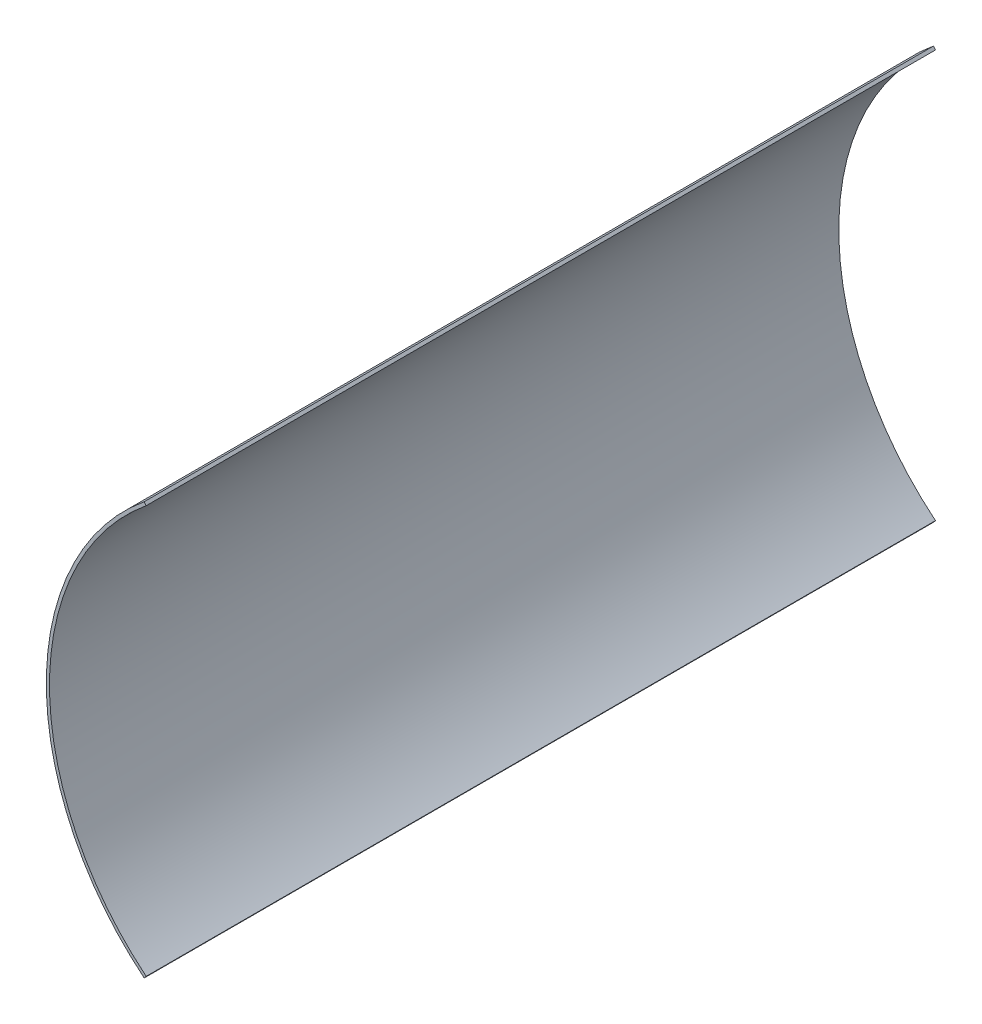
ISO-10303-21;
HEADER;
FILE_DESCRIPTION(('STEP AP214'),'2;1');
FILE_NAME('part.step','',(''),(''),'','','');
FILE_SCHEMA(('AUTOMOTIVE_DESIGN { 1 0 10303 214 1 1 1 1 }'));
ENDSEC;
DATA;
#1=APPLICATION_CONTEXT('core data for automotive mechanical design processes');
#2=APPLICATION_PROTOCOL_DEFINITION('international standard','automotive_design',2000,#1);
#3=PRODUCT_CONTEXT('',#1,'mechanical');
#4=PRODUCT('Part','Part','',(#3));
#5=PRODUCT_RELATED_PRODUCT_CATEGORY('part','',(#4));
#6=PRODUCT_DEFINITION_FORMATION('','',#4);
#7=PRODUCT_DEFINITION_CONTEXT('part definition',#1,'design');
#8=PRODUCT_DEFINITION('design','',#6,#7);
#9=PRODUCT_DEFINITION_SHAPE('','',#8);
#10=(LENGTH_UNIT() NAMED_UNIT(*) SI_UNIT(.MILLI.,.METRE.));
#11=(NAMED_UNIT(*) PLANE_ANGLE_UNIT() SI_UNIT($,.RADIAN.));
#12=(NAMED_UNIT(*) SI_UNIT($,.STERADIAN.) SOLID_ANGLE_UNIT());
#13=UNCERTAINTY_MEASURE_WITH_UNIT(LENGTH_MEASURE(1.E-05),#10,'distance_accuracy_value','');
#14=(GEOMETRIC_REPRESENTATION_CONTEXT(3) GLOBAL_UNCERTAINTY_ASSIGNED_CONTEXT((#13)) GLOBAL_UNIT_ASSIGNED_CONTEXT((#10,
#11,#12)) REPRESENTATION_CONTEXT('',''));
#15=CARTESIAN_POINT('',(0.,0.,0.));
#16=DIRECTION('',(0.,0.,1.));
#17=DIRECTION('',(1.,0.,0.));
#18=AXIS2_PLACEMENT_3D('',#15,#16,#17);
#19=CARTESIAN_POINT('',(0.,249.999999999999,750.));
#20=DIRECTION('',(0.,0.,-1.));
#21=DIRECTION('',(-1.,0.,0.));
#22=AXIS2_PLACEMENT_3D('',#19,#20,#21);
#23=CYLINDRICAL_SURFACE('',#22,253.);
#24=CARTESIAN_POINT('',(0.,250.,0.));
#25=DIRECTION('',(0.,0.,1.));
#26=DIRECTION('',(1.,0.,0.));
#27=AXIS2_PLACEMENT_3D('',#24,#25,#26);
#28=CIRCLE('',#27,253.);
#29=CARTESIAN_POINT('',(-160.01124960452,445.972957318095,3.33066907387547E-13));
#30=VERTEX_POINT('',#29);
#31=CARTESIAN_POINT('',(-160.01124960452,54.0270426819047,3.33066907387547E-13));
#32=VERTEX_POINT('',#31);
#33=EDGE_CURVE('E110',#30,#32,#28,.T.);
#34=ORIENTED_EDGE('',*,*,#33,.T.);
#35=DIRECTION('',(0.,0.,-1.));
#36=VECTOR('',#35,1.);
#37=CARTESIAN_POINT('',(-160.01124960452,54.0270426819047,750.));
#38=LINE('',#37,#36);
#39=CARTESIAN_POINT('',(-160.01124960452,54.0270426819047,750.));
#40=VERTEX_POINT('',#39);
#41=EDGE_CURVE('E13',#40,#32,#38,.T.);
#42=ORIENTED_EDGE('',*,*,#41,.F.);
#43=CARTESIAN_POINT('',(0.,249.999999999999,750.));
#44=DIRECTION('',(0.,0.,1.));
#45=DIRECTION('',(1.,0.,0.));
#46=AXIS2_PLACEMENT_3D('',#43,#44,#45);
#47=CIRCLE('',#46,253.);
#48=CARTESIAN_POINT('',(-160.01124960452,445.972957318095,750.000000000001));
#49=VERTEX_POINT('',#48);
#50=EDGE_CURVE('E87',#49,#40,#47,.T.);
#51=ORIENTED_EDGE('',*,*,#50,.F.);
#52=DIRECTION('',(0.,0.,-1.));
#53=VECTOR('',#52,1.);
#54=CARTESIAN_POINT('',(-160.01124960452,445.972957318095,750.000000000001));
#55=LINE('',#54,#53);
#56=EDGE_CURVE('E63',#49,#30,#55,.T.);
#57=ORIENTED_EDGE('',*,*,#56,.T.);
#58=EDGE_LOOP('',(#34,#42,#51,#57));
#59=FACE_BOUND('',#58,.T.);
#60=ADVANCED_FACE('F47',(#59),#23,.T.);
#61=CARTESIAN_POINT('',(-158.113883008419,56.3508326896292,750.));
#62=DIRECTION('',(0.774596669241481,-0.632455532033678,0.));
#63=DIRECTION('',(0.632455532033678,0.774596669241482,0.));
#64=AXIS2_PLACEMENT_3D('',#61,#62,#63);
#65=PLANE('',#64);
#66=DIRECTION('',(-0.632455532033678,-0.774596669241482,0.));
#67=VECTOR('',#66,1.);
#68=CARTESIAN_POINT('',(-158.113883008419,56.3508326896292,3.33066907387547E-13));
#69=LINE('',#68,#67);
#70=CARTESIAN_POINT('',(-158.113883008419,56.3508326896292,3.33066907387547E-13));
#71=VERTEX_POINT('',#70);
#72=EDGE_CURVE('E96',#71,#32,#69,.T.);
#73=ORIENTED_EDGE('',*,*,#72,.F.);
#74=DIRECTION('',(0.,0.,-1.));
#75=VECTOR('',#74,1.);
#76=CARTESIAN_POINT('',(-158.113883008419,56.3508326896292,750.));
#77=LINE('',#76,#75);
#78=CARTESIAN_POINT('',(-158.113883008419,56.3508326896292,750.));
#79=VERTEX_POINT('',#78);
#80=EDGE_CURVE('E55',#79,#71,#77,.T.);
#81=ORIENTED_EDGE('',*,*,#80,.F.);
#82=DIRECTION('',(-0.632455532033678,-0.774596669241482,0.));
#83=VECTOR('',#82,1.);
#84=CARTESIAN_POINT('',(-158.113883008419,56.3508326896292,750.));
#85=LINE('',#84,#83);
#86=EDGE_CURVE('E94',#79,#40,#85,.T.);
#87=ORIENTED_EDGE('',*,*,#86,.T.);
#88=ORIENTED_EDGE('',*,*,#41,.T.);
#89=EDGE_LOOP('',(#73,#81,#87,#88));
#90=FACE_BOUND('',#89,.T.);
#91=ADVANCED_FACE('F93',(#90),#65,.T.);
#92=CARTESIAN_POINT('',(0.,249.999999999999,750.));
#93=DIRECTION('',(0.,0.,-1.));
#94=DIRECTION('',(-1.,0.,0.));
#95=AXIS2_PLACEMENT_3D('',#92,#93,#94);
#96=CYLINDRICAL_SURFACE('',#95,250.);
#97=CARTESIAN_POINT('',(0.,250.,0.));
#98=DIRECTION('',(0.,0.,1.));
#99=DIRECTION('',(1.,0.,0.));
#100=AXIS2_PLACEMENT_3D('',#97,#98,#99);
#101=CIRCLE('',#100,250.);
#102=CARTESIAN_POINT('',(-158.113883008419,443.649167310371,3.33066907387547E-13));
#103=VERTEX_POINT('',#102);
#104=EDGE_CURVE('E113',#103,#71,#101,.T.);
#105=ORIENTED_EDGE('',*,*,#104,.F.);
#106=DIRECTION('',(0.,0.,-1.));
#107=VECTOR('',#106,1.);
#108=CARTESIAN_POINT('',(-158.113883008419,443.649167310371,750.000000000001));
#109=LINE('',#108,#107);
#110=CARTESIAN_POINT('',(-158.113883008419,443.649167310371,750.000000000001));
#111=VERTEX_POINT('',#110);
#112=EDGE_CURVE('E76',#111,#103,#109,.T.);
#113=ORIENTED_EDGE('',*,*,#112,.F.);
#114=CARTESIAN_POINT('',(0.,249.999999999999,750.));
#115=DIRECTION('',(0.,0.,1.));
#116=DIRECTION('',(1.,0.,0.));
#117=AXIS2_PLACEMENT_3D('',#114,#115,#116);
#118=CIRCLE('',#117,250.);
#119=EDGE_CURVE('E102',#111,#79,#118,.T.);
#120=ORIENTED_EDGE('',*,*,#119,.T.);
#121=ORIENTED_EDGE('',*,*,#80,.T.);
#122=EDGE_LOOP('',(#105,#113,#120,#121));
#123=FACE_BOUND('',#122,.T.);
#124=ADVANCED_FACE('F104',(#123),#96,.F.);
#125=CARTESIAN_POINT('',(-160.01124960452,445.972957318095,750.000000000001));
#126=DIRECTION('',(0.774596669241478,0.632455532033683,0.));
#127=DIRECTION('',(-0.632455532033683,0.774596669241478,0.));
#128=AXIS2_PLACEMENT_3D('',#125,#126,#127);
#129=PLANE('',#128);
#130=DIRECTION('',(0.632455532033683,-0.774596669241478,0.));
#131=VECTOR('',#130,1.);
#132=CARTESIAN_POINT('',(-160.01124960452,445.972957318095,3.33066907387547E-13));
#133=LINE('',#132,#131);
#134=EDGE_CURVE('E115',#30,#103,#133,.T.);
#135=ORIENTED_EDGE('',*,*,#134,.F.);
#136=ORIENTED_EDGE('',*,*,#56,.F.);
#137=DIRECTION('',(0.632455532033683,-0.774596669241478,0.));
#138=VECTOR('',#137,1.);
#139=CARTESIAN_POINT('',(-160.01124960452,445.972957318095,750.000000000001));
#140=LINE('',#139,#138);
#141=EDGE_CURVE('E105',#49,#111,#140,.T.);
#142=ORIENTED_EDGE('',*,*,#141,.T.);
#143=ORIENTED_EDGE('',*,*,#112,.T.);
#144=EDGE_LOOP('',(#135,#136,#142,#143));
#145=FACE_BOUND('',#144,.T.);
#146=ADVANCED_FACE('F121',(#145),#129,.T.);
#147=CARTESIAN_POINT('',(0.,249.999999999999,750.));
#148=DIRECTION('',(0.,0.,1.));
#149=DIRECTION('',(1.,0.,0.));
#150=AXIS2_PLACEMENT_3D('',#147,#148,#149);
#151=PLANE('',#150);
#152=ORIENTED_EDGE('',*,*,#50,.T.);
#153=ORIENTED_EDGE('',*,*,#86,.F.);
#154=ORIENTED_EDGE('',*,*,#119,.F.);
#155=ORIENTED_EDGE('',*,*,#141,.F.);
#156=EDGE_LOOP('',(#152,#153,#154,#155));
#157=FACE_BOUND('',#156,.T.);
#158=ADVANCED_FACE('F101',(#157),#151,.T.);
#159=CARTESIAN_POINT('',(0.,250.,0.));
#160=DIRECTION('',(0.,0.,1.));
#161=DIRECTION('',(1.,0.,0.));
#162=AXIS2_PLACEMENT_3D('',#159,#160,#161);
#163=PLANE('',#162);
#164=ORIENTED_EDGE('',*,*,#33,.F.);
#165=ORIENTED_EDGE('',*,*,#134,.T.);
#166=ORIENTED_EDGE('',*,*,#104,.T.);
#167=ORIENTED_EDGE('',*,*,#72,.T.);
#168=EDGE_LOOP('',(#164,#165,#166,#167));
#169=FACE_BOUND('',#168,.T.);
#170=ADVANCED_FACE('F120',(#169),#163,.F.);
#171=CLOSED_SHELL('',(#60,#91,#124,#146,#158,#170));
#172=MANIFOLD_SOLID_BREP('B2',#171);
#173=ADVANCED_BREP_SHAPE_REPRESENTATION('',(#18,#172),#14);
#174=SHAPE_DEFINITION_REPRESENTATION(#9,#173);
ENDSEC;
END-ISO-10303-21;
